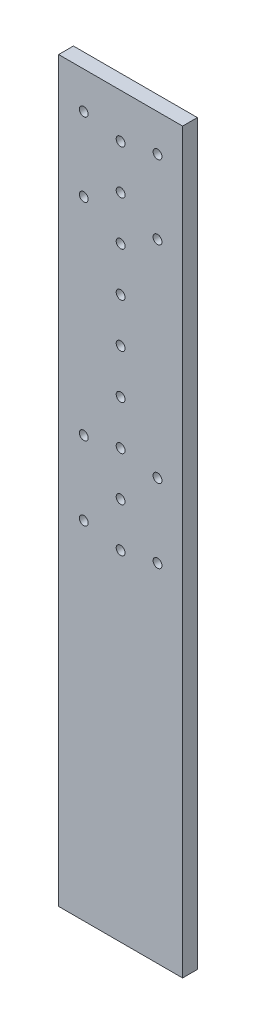
ISO-10303-21;
HEADER;
FILE_DESCRIPTION(('STEP AP214'),'2;1');
FILE_NAME('part.step','',(''),(''),'','','');
FILE_SCHEMA(('AUTOMOTIVE_DESIGN { 1 0 10303 214 1 1 1 1 }'));
ENDSEC;
DATA;
#1=APPLICATION_CONTEXT('core data for automotive mechanical design processes');
#2=APPLICATION_PROTOCOL_DEFINITION('international standard','automotive_design',2000,#1);
#3=PRODUCT_CONTEXT('',#1,'mechanical');
#4=PRODUCT('Part','Part','',(#3));
#5=PRODUCT_RELATED_PRODUCT_CATEGORY('part','',(#4));
#6=PRODUCT_DEFINITION_FORMATION('','',#4);
#7=PRODUCT_DEFINITION_CONTEXT('part definition',#1,'design');
#8=PRODUCT_DEFINITION('design','',#6,#7);
#9=PRODUCT_DEFINITION_SHAPE('','',#8);
#10=(LENGTH_UNIT() NAMED_UNIT(*) SI_UNIT(.MILLI.,.METRE.));
#11=(NAMED_UNIT(*) PLANE_ANGLE_UNIT() SI_UNIT($,.RADIAN.));
#12=(NAMED_UNIT(*) SI_UNIT($,.STERADIAN.) SOLID_ANGLE_UNIT());
#13=UNCERTAINTY_MEASURE_WITH_UNIT(LENGTH_MEASURE(1.E-05),#10,'distance_accuracy_value','');
#14=(GEOMETRIC_REPRESENTATION_CONTEXT(3) GLOBAL_UNCERTAINTY_ASSIGNED_CONTEXT((#13)) GLOBAL_UNIT_ASSIGNED_CONTEXT((#10,
#11,#12)) REPRESENTATION_CONTEXT('',''));
#15=CARTESIAN_POINT('',(0.,0.,0.));
#16=DIRECTION('',(0.,0.,1.));
#17=DIRECTION('',(1.,0.,0.));
#18=AXIS2_PLACEMENT_3D('',#15,#16,#17);
#19=CARTESIAN_POINT('',(0.,0.,5.));
#20=DIRECTION('',(1.,0.,0.));
#21=DIRECTION('',(0.,0.,-1.));
#22=AXIS2_PLACEMENT_3D('',#19,#20,#21);
#23=PLANE('',#22);
#24=DIRECTION('',(0.,-1.,0.));
#25=VECTOR('',#24,1.);
#26=CARTESIAN_POINT('',(0.,0.,0.));
#27=LINE('',#26,#25);
#28=CARTESIAN_POINT('',(0.,250.,0.));
#29=VERTEX_POINT('',#28);
#30=CARTESIAN_POINT('',(0.,0.,0.));
#31=VERTEX_POINT('',#30);
#32=EDGE_CURVE('E96',#29,#31,#27,.T.);
#33=ORIENTED_EDGE('',*,*,#32,.T.);
#34=DIRECTION('',(0.,0.,-1.));
#35=VECTOR('',#34,1.);
#36=CARTESIAN_POINT('',(0.,0.,5.));
#37=LINE('',#36,#35);
#38=CARTESIAN_POINT('',(0.,0.,5.));
#39=VERTEX_POINT('',#38);
#40=EDGE_CURVE('E11',#39,#31,#37,.T.);
#41=ORIENTED_EDGE('',*,*,#40,.F.);
#42=DIRECTION('',(0.,-1.,0.));
#43=VECTOR('',#42,1.);
#44=CARTESIAN_POINT('',(0.,0.,5.));
#45=LINE('',#44,#43);
#46=CARTESIAN_POINT('',(0.,250.,5.));
#47=VERTEX_POINT('',#46);
#48=EDGE_CURVE('E84',#47,#39,#45,.T.);
#49=ORIENTED_EDGE('',*,*,#48,.F.);
#50=DIRECTION('',(0.,0.,-1.));
#51=VECTOR('',#50,1.);
#52=CARTESIAN_POINT('',(0.,250.,5.));
#53=LINE('',#52,#51);
#54=EDGE_CURVE('E92',#47,#29,#53,.T.);
#55=ORIENTED_EDGE('',*,*,#54,.T.);
#56=EDGE_LOOP('',(#33,#41,#49,#55));
#57=FACE_BOUND('',#56,.T.);
#58=ADVANCED_FACE('F33',(#57),#23,.F.);
#59=CARTESIAN_POINT('',(0.,0.,5.));
#60=DIRECTION('',(0.,1.,0.));
#61=DIRECTION('',(0.,0.,1.));
#62=AXIS2_PLACEMENT_3D('',#59,#60,#61);
#63=PLANE('',#62);
#64=DIRECTION('',(1.,0.,0.));
#65=VECTOR('',#64,1.);
#66=CARTESIAN_POINT('',(0.,0.,0.));
#67=LINE('',#66,#65);
#68=CARTESIAN_POINT('',(42.,0.,0.));
#69=VERTEX_POINT('',#68);
#70=EDGE_CURVE('E88',#31,#69,#67,.T.);
#71=ORIENTED_EDGE('',*,*,#70,.T.);
#72=DIRECTION('',(0.,0.,-1.));
#73=VECTOR('',#72,1.);
#74=CARTESIAN_POINT('',(42.,0.,5.));
#75=LINE('',#74,#73);
#76=CARTESIAN_POINT('',(42.,0.,5.));
#77=VERTEX_POINT('',#76);
#78=EDGE_CURVE('E41',#77,#69,#75,.T.);
#79=ORIENTED_EDGE('',*,*,#78,.F.);
#80=DIRECTION('',(1.,0.,0.));
#81=VECTOR('',#80,1.);
#82=CARTESIAN_POINT('',(0.,0.,5.));
#83=LINE('',#82,#81);
#84=EDGE_CURVE('E79',#39,#77,#83,.T.);
#85=ORIENTED_EDGE('',*,*,#84,.F.);
#86=ORIENTED_EDGE('',*,*,#40,.T.);
#87=EDGE_LOOP('',(#71,#79,#85,#86));
#88=FACE_BOUND('',#87,.T.);
#89=ADVANCED_FACE('F87',(#88),#63,.F.);
#90=CARTESIAN_POINT('',(42.,0.,5.));
#91=DIRECTION('',(-1.,0.,0.));
#92=DIRECTION('',(0.,0.,1.));
#93=AXIS2_PLACEMENT_3D('',#90,#91,#92);
#94=PLANE('',#93);
#95=DIRECTION('',(0.,1.,0.));
#96=VECTOR('',#95,1.);
#97=CARTESIAN_POINT('',(42.,0.,0.));
#98=LINE('',#97,#96);
#99=CARTESIAN_POINT('',(42.,250.,0.));
#100=VERTEX_POINT('',#99);
#101=EDGE_CURVE('E66',#69,#100,#98,.T.);
#102=ORIENTED_EDGE('',*,*,#101,.T.);
#103=DIRECTION('',(0.,0.,-1.));
#104=VECTOR('',#103,1.);
#105=CARTESIAN_POINT('',(42.,250.,5.));
#106=LINE('',#105,#104);
#107=CARTESIAN_POINT('',(42.,250.,5.));
#108=VERTEX_POINT('',#107);
#109=EDGE_CURVE('E89',#108,#100,#106,.T.);
#110=ORIENTED_EDGE('',*,*,#109,.F.);
#111=DIRECTION('',(0.,1.,0.));
#112=VECTOR('',#111,1.);
#113=CARTESIAN_POINT('',(42.,0.,5.));
#114=LINE('',#113,#112);
#115=EDGE_CURVE('E82',#77,#108,#114,.T.);
#116=ORIENTED_EDGE('',*,*,#115,.F.);
#117=ORIENTED_EDGE('',*,*,#78,.T.);
#118=EDGE_LOOP('',(#102,#110,#116,#117));
#119=FACE_BOUND('',#118,.T.);
#120=ADVANCED_FACE('F90',(#119),#94,.F.);
#121=CARTESIAN_POINT('',(0.,250.,5.));
#122=DIRECTION('',(0.,-1.,0.));
#123=DIRECTION('',(0.,0.,-1.));
#124=AXIS2_PLACEMENT_3D('',#121,#122,#123);
#125=PLANE('',#124);
#126=DIRECTION('',(-1.,0.,0.));
#127=VECTOR('',#126,1.);
#128=CARTESIAN_POINT('',(0.,250.,0.));
#129=LINE('',#128,#127);
#130=EDGE_CURVE('E72',#100,#29,#129,.T.);
#131=ORIENTED_EDGE('',*,*,#130,.T.);
#132=ORIENTED_EDGE('',*,*,#54,.F.);
#133=DIRECTION('',(-1.,0.,0.));
#134=VECTOR('',#133,1.);
#135=CARTESIAN_POINT('',(0.,250.,5.));
#136=LINE('',#135,#134);
#137=EDGE_CURVE('E49',#108,#47,#136,.T.);
#138=ORIENTED_EDGE('',*,*,#137,.F.);
#139=ORIENTED_EDGE('',*,*,#109,.T.);
#140=EDGE_LOOP('',(#131,#132,#138,#139));
#141=FACE_BOUND('',#140,.T.);
#142=ADVANCED_FACE('F104',(#141),#125,.F.);
#143=CARTESIAN_POINT('',(0.,0.,5.));
#144=DIRECTION('',(0.,0.,-1.));
#145=DIRECTION('',(-1.,0.,0.));
#146=AXIS2_PLACEMENT_3D('',#143,#144,#145);
#147=PLANE('',#146);
#148=CARTESIAN_POINT('',(8.5,117.5,5.));
#149=DIRECTION('',(0.,0.,1.));
#150=DIRECTION('',(1.,0.,0.));
#151=AXIS2_PLACEMENT_3D('',#148,#149,#150);
#152=CIRCLE('',#151,1.5);
#153=CARTESIAN_POINT('',(10.,117.5,5.));
#154=VERTEX_POINT('',#153);
#155=EDGE_CURVE('E206',#154,#154,#152,.T.);
#156=ORIENTED_EDGE('',*,*,#155,.F.);
#157=EDGE_LOOP('',(#156));
#158=FACE_BOUND('',#157,.T.);
#159=CARTESIAN_POINT('',(33.5,117.5,5.));
#160=DIRECTION('',(0.,0.,1.));
#161=DIRECTION('',(1.,0.,0.));
#162=AXIS2_PLACEMENT_3D('',#159,#160,#161);
#163=CIRCLE('',#162,1.5);
#164=CARTESIAN_POINT('',(35.,117.5,5.));
#165=VERTEX_POINT('',#164);
#166=EDGE_CURVE('E200',#165,#165,#163,.T.);
#167=ORIENTED_EDGE('',*,*,#166,.F.);
#168=EDGE_LOOP('',(#167));
#169=FACE_BOUND('',#168,.T.);
#170=CARTESIAN_POINT('',(33.5,142.5,5.));
#171=DIRECTION('',(0.,0.,1.));
#172=DIRECTION('',(1.,0.,0.));
#173=AXIS2_PLACEMENT_3D('',#170,#171,#172);
#174=CIRCLE('',#173,1.5);
#175=CARTESIAN_POINT('',(35.,142.5,5.));
#176=VERTEX_POINT('',#175);
#177=EDGE_CURVE('E194',#176,#176,#174,.T.);
#178=ORIENTED_EDGE('',*,*,#177,.F.);
#179=EDGE_LOOP('',(#178));
#180=FACE_BOUND('',#179,.T.);
#181=CARTESIAN_POINT('',(8.5,142.5,5.));
#182=DIRECTION('',(0.,0.,1.));
#183=DIRECTION('',(1.,0.,0.));
#184=AXIS2_PLACEMENT_3D('',#181,#182,#183);
#185=CIRCLE('',#184,1.5);
#186=CARTESIAN_POINT('',(10.,142.5,5.));
#187=VERTEX_POINT('',#186);
#188=EDGE_CURVE('E188',#187,#187,#185,.T.);
#189=ORIENTED_EDGE('',*,*,#188,.F.);
#190=EDGE_LOOP('',(#189));
#191=FACE_BOUND('',#190,.T.);
#192=CARTESIAN_POINT('',(8.49999999999998,212.5,5.));
#193=DIRECTION('',(0.,0.,1.));
#194=DIRECTION('',(1.,0.,0.));
#195=AXIS2_PLACEMENT_3D('',#192,#193,#194);
#196=CIRCLE('',#195,1.5);
#197=CARTESIAN_POINT('',(9.99999999999999,212.5,5.));
#198=VERTEX_POINT('',#197);
#199=EDGE_CURVE('E182',#198,#198,#196,.T.);
#200=ORIENTED_EDGE('',*,*,#199,.F.);
#201=EDGE_LOOP('',(#200));
#202=FACE_BOUND('',#201,.T.);
#203=CARTESIAN_POINT('',(33.5,212.5,5.));
#204=DIRECTION('',(0.,0.,1.));
#205=DIRECTION('',(1.,0.,0.));
#206=AXIS2_PLACEMENT_3D('',#203,#204,#205);
#207=CIRCLE('',#206,1.5);
#208=CARTESIAN_POINT('',(35.,212.5,5.));
#209=VERTEX_POINT('',#208);
#210=EDGE_CURVE('E176',#209,#209,#207,.T.);
#211=ORIENTED_EDGE('',*,*,#210,.F.);
#212=EDGE_LOOP('',(#211));
#213=FACE_BOUND('',#212,.T.);
#214=CARTESIAN_POINT('',(33.5,237.5,5.));
#215=DIRECTION('',(0.,0.,1.));
#216=DIRECTION('',(1.,0.,0.));
#217=AXIS2_PLACEMENT_3D('',#214,#215,#216);
#218=CIRCLE('',#217,1.5);
#219=CARTESIAN_POINT('',(35.,237.5,5.));
#220=VERTEX_POINT('',#219);
#221=EDGE_CURVE('E170',#220,#220,#218,.T.);
#222=ORIENTED_EDGE('',*,*,#221,.F.);
#223=EDGE_LOOP('',(#222));
#224=FACE_BOUND('',#223,.T.);
#225=CARTESIAN_POINT('',(8.49999999999998,237.5,5.));
#226=DIRECTION('',(0.,0.,1.));
#227=DIRECTION('',(1.,0.,0.));
#228=AXIS2_PLACEMENT_3D('',#225,#226,#227);
#229=CIRCLE('',#228,1.5);
#230=CARTESIAN_POINT('',(9.99999999999998,237.5,5.));
#231=VERTEX_POINT('',#230);
#232=EDGE_CURVE('E164',#231,#231,#229,.T.);
#233=ORIENTED_EDGE('',*,*,#232,.F.);
#234=EDGE_LOOP('',(#233));
#235=FACE_BOUND('',#234,.T.);
#236=CARTESIAN_POINT('',(21.0000000000012,115.,5.));
#237=DIRECTION('',(0.,0.,1.));
#238=DIRECTION('',(1.,0.,0.));
#239=AXIS2_PLACEMENT_3D('',#236,#237,#238);
#240=CIRCLE('',#239,1.5);
#241=CARTESIAN_POINT('',(22.5000000000012,115.,5.));
#242=VERTEX_POINT('',#241);
#243=EDGE_CURVE('E158',#242,#242,#240,.T.);
#244=ORIENTED_EDGE('',*,*,#243,.F.);
#245=EDGE_LOOP('',(#244));
#246=FACE_BOUND('',#245,.T.);
#247=CARTESIAN_POINT('',(21.0000000000011,130.,5.));
#248=DIRECTION('',(0.,0.,1.));
#249=DIRECTION('',(1.,0.,0.));
#250=AXIS2_PLACEMENT_3D('',#247,#248,#249);
#251=CIRCLE('',#250,1.5);
#252=CARTESIAN_POINT('',(22.5000000000011,130.,5.));
#253=VERTEX_POINT('',#252);
#254=EDGE_CURVE('E152',#253,#253,#251,.T.);
#255=ORIENTED_EDGE('',*,*,#254,.F.);
#256=EDGE_LOOP('',(#255));
#257=FACE_BOUND('',#256,.T.);
#258=CARTESIAN_POINT('',(21.0000000000009,145.,5.));
#259=DIRECTION('',(0.,0.,1.));
#260=DIRECTION('',(1.,0.,0.));
#261=AXIS2_PLACEMENT_3D('',#258,#259,#260);
#262=CIRCLE('',#261,1.5);
#263=CARTESIAN_POINT('',(22.5000000000009,145.,5.));
#264=VERTEX_POINT('',#263);
#265=EDGE_CURVE('E146',#264,#264,#262,.T.);
#266=ORIENTED_EDGE('',*,*,#265,.F.);
#267=EDGE_LOOP('',(#266));
#268=FACE_BOUND('',#267,.T.);
#269=CARTESIAN_POINT('',(21.0000000000008,160.,5.));
#270=DIRECTION('',(0.,0.,1.));
#271=DIRECTION('',(1.,0.,0.));
#272=AXIS2_PLACEMENT_3D('',#269,#270,#271);
#273=CIRCLE('',#272,1.5);
#274=CARTESIAN_POINT('',(22.5000000000008,160.,5.));
#275=VERTEX_POINT('',#274);
#276=EDGE_CURVE('E140',#275,#275,#273,.T.);
#277=ORIENTED_EDGE('',*,*,#276,.F.);
#278=EDGE_LOOP('',(#277));
#279=FACE_BOUND('',#278,.T.);
#280=CARTESIAN_POINT('',(21.0000000000006,175.,5.));
#281=DIRECTION('',(0.,0.,1.));
#282=DIRECTION('',(1.,0.,0.));
#283=AXIS2_PLACEMENT_3D('',#280,#281,#282);
#284=CIRCLE('',#283,1.5);
#285=CARTESIAN_POINT('',(22.5000000000006,175.,5.));
#286=VERTEX_POINT('',#285);
#287=EDGE_CURVE('E134',#286,#286,#284,.T.);
#288=ORIENTED_EDGE('',*,*,#287,.F.);
#289=EDGE_LOOP('',(#288));
#290=FACE_BOUND('',#289,.T.);
#291=CARTESIAN_POINT('',(21.0000000000004,190.,5.));
#292=DIRECTION('',(0.,0.,1.));
#293=DIRECTION('',(1.,0.,0.));
#294=AXIS2_PLACEMENT_3D('',#291,#292,#293);
#295=CIRCLE('',#294,1.5);
#296=CARTESIAN_POINT('',(22.5000000000004,190.,5.));
#297=VERTEX_POINT('',#296);
#298=EDGE_CURVE('E128',#297,#297,#295,.T.);
#299=ORIENTED_EDGE('',*,*,#298,.F.);
#300=EDGE_LOOP('',(#299));
#301=FACE_BOUND('',#300,.T.);
#302=CARTESIAN_POINT('',(21.0000000000003,205.,5.));
#303=DIRECTION('',(0.,0.,1.));
#304=DIRECTION('',(1.,0.,0.));
#305=AXIS2_PLACEMENT_3D('',#302,#303,#304);
#306=CIRCLE('',#305,1.5);
#307=CARTESIAN_POINT('',(22.5000000000003,205.,5.));
#308=VERTEX_POINT('',#307);
#309=EDGE_CURVE('E122',#308,#308,#306,.T.);
#310=ORIENTED_EDGE('',*,*,#309,.F.);
#311=EDGE_LOOP('',(#310));
#312=FACE_BOUND('',#311,.T.);
#313=CARTESIAN_POINT('',(21.0000000000001,220.,5.));
#314=DIRECTION('',(0.,0.,1.));
#315=DIRECTION('',(1.,0.,0.));
#316=AXIS2_PLACEMENT_3D('',#313,#314,#315);
#317=CIRCLE('',#316,1.5);
#318=CARTESIAN_POINT('',(22.5000000000001,220.,5.));
#319=VERTEX_POINT('',#318);
#320=EDGE_CURVE('E116',#319,#319,#317,.T.);
#321=ORIENTED_EDGE('',*,*,#320,.F.);
#322=EDGE_LOOP('',(#321));
#323=FACE_BOUND('',#322,.T.);
#324=CARTESIAN_POINT('',(21.,235.,5.));
#325=DIRECTION('',(0.,0.,1.));
#326=DIRECTION('',(1.,0.,0.));
#327=AXIS2_PLACEMENT_3D('',#324,#325,#326);
#328=CIRCLE('',#327,1.5);
#329=CARTESIAN_POINT('',(22.5,235.,5.));
#330=VERTEX_POINT('',#329);
#331=EDGE_CURVE('E110',#330,#330,#328,.T.);
#332=ORIENTED_EDGE('',*,*,#331,.F.);
#333=EDGE_LOOP('',(#332));
#334=FACE_BOUND('',#333,.T.);
#335=ORIENTED_EDGE('',*,*,#48,.T.);
#336=ORIENTED_EDGE('',*,*,#84,.T.);
#337=ORIENTED_EDGE('',*,*,#115,.T.);
#338=ORIENTED_EDGE('',*,*,#137,.T.);
#339=EDGE_LOOP('',(#335,#336,#337,#338));
#340=FACE_BOUND('',#339,.T.);
#341=ADVANCED_FACE('F80',(#158,#169,#180,#191,#202,#213,#224,#235,#246,#257,#268,#279,#290,#301,
#312,#323,#334,#340),#147,.F.);
#342=CARTESIAN_POINT('',(0.,0.,0.));
#343=DIRECTION('',(0.,0.,-1.));
#344=DIRECTION('',(-1.,0.,0.));
#345=AXIS2_PLACEMENT_3D('',#342,#343,#344);
#346=PLANE('',#345);
#347=CARTESIAN_POINT('',(8.5,117.5,0.));
#348=DIRECTION('',(0.,0.,1.));
#349=DIRECTION('',(1.,0.,0.));
#350=AXIS2_PLACEMENT_3D('',#347,#348,#349);
#351=CIRCLE('',#350,1.5);
#352=CARTESIAN_POINT('',(10.,117.5,0.));
#353=VERTEX_POINT('',#352);
#354=EDGE_CURVE('E203',#353,#353,#351,.T.);
#355=ORIENTED_EDGE('',*,*,#354,.T.);
#356=EDGE_LOOP('',(#355));
#357=FACE_BOUND('',#356,.T.);
#358=CARTESIAN_POINT('',(33.5,117.5,0.));
#359=DIRECTION('',(0.,0.,1.));
#360=DIRECTION('',(1.,0.,0.));
#361=AXIS2_PLACEMENT_3D('',#358,#359,#360);
#362=CIRCLE('',#361,1.5);
#363=CARTESIAN_POINT('',(35.,117.5,0.));
#364=VERTEX_POINT('',#363);
#365=EDGE_CURVE('E197',#364,#364,#362,.T.);
#366=ORIENTED_EDGE('',*,*,#365,.T.);
#367=EDGE_LOOP('',(#366));
#368=FACE_BOUND('',#367,.T.);
#369=CARTESIAN_POINT('',(33.5,142.5,0.));
#370=DIRECTION('',(0.,0.,1.));
#371=DIRECTION('',(1.,0.,0.));
#372=AXIS2_PLACEMENT_3D('',#369,#370,#371);
#373=CIRCLE('',#372,1.5);
#374=CARTESIAN_POINT('',(35.,142.5,0.));
#375=VERTEX_POINT('',#374);
#376=EDGE_CURVE('E191',#375,#375,#373,.T.);
#377=ORIENTED_EDGE('',*,*,#376,.T.);
#378=EDGE_LOOP('',(#377));
#379=FACE_BOUND('',#378,.T.);
#380=CARTESIAN_POINT('',(8.5,142.5,0.));
#381=DIRECTION('',(0.,0.,1.));
#382=DIRECTION('',(1.,0.,0.));
#383=AXIS2_PLACEMENT_3D('',#380,#381,#382);
#384=CIRCLE('',#383,1.5);
#385=CARTESIAN_POINT('',(10.,142.5,0.));
#386=VERTEX_POINT('',#385);
#387=EDGE_CURVE('E185',#386,#386,#384,.T.);
#388=ORIENTED_EDGE('',*,*,#387,.T.);
#389=EDGE_LOOP('',(#388));
#390=FACE_BOUND('',#389,.T.);
#391=CARTESIAN_POINT('',(8.49999999999998,212.5,0.));
#392=DIRECTION('',(0.,0.,1.));
#393=DIRECTION('',(1.,0.,0.));
#394=AXIS2_PLACEMENT_3D('',#391,#392,#393);
#395=CIRCLE('',#394,1.5);
#396=CARTESIAN_POINT('',(9.99999999999999,212.5,0.));
#397=VERTEX_POINT('',#396);
#398=EDGE_CURVE('E179',#397,#397,#395,.T.);
#399=ORIENTED_EDGE('',*,*,#398,.T.);
#400=EDGE_LOOP('',(#399));
#401=FACE_BOUND('',#400,.T.);
#402=CARTESIAN_POINT('',(33.5,212.5,0.));
#403=DIRECTION('',(0.,0.,1.));
#404=DIRECTION('',(1.,0.,0.));
#405=AXIS2_PLACEMENT_3D('',#402,#403,#404);
#406=CIRCLE('',#405,1.5);
#407=CARTESIAN_POINT('',(35.,212.5,0.));
#408=VERTEX_POINT('',#407);
#409=EDGE_CURVE('E173',#408,#408,#406,.T.);
#410=ORIENTED_EDGE('',*,*,#409,.T.);
#411=EDGE_LOOP('',(#410));
#412=FACE_BOUND('',#411,.T.);
#413=CARTESIAN_POINT('',(33.5,237.5,0.));
#414=DIRECTION('',(0.,0.,1.));
#415=DIRECTION('',(1.,0.,0.));
#416=AXIS2_PLACEMENT_3D('',#413,#414,#415);
#417=CIRCLE('',#416,1.5);
#418=CARTESIAN_POINT('',(35.,237.5,0.));
#419=VERTEX_POINT('',#418);
#420=EDGE_CURVE('E167',#419,#419,#417,.T.);
#421=ORIENTED_EDGE('',*,*,#420,.T.);
#422=EDGE_LOOP('',(#421));
#423=FACE_BOUND('',#422,.T.);
#424=CARTESIAN_POINT('',(8.49999999999998,237.5,0.));
#425=DIRECTION('',(0.,0.,1.));
#426=DIRECTION('',(1.,0.,0.));
#427=AXIS2_PLACEMENT_3D('',#424,#425,#426);
#428=CIRCLE('',#427,1.5);
#429=CARTESIAN_POINT('',(9.99999999999998,237.5,0.));
#430=VERTEX_POINT('',#429);
#431=EDGE_CURVE('E161',#430,#430,#428,.T.);
#432=ORIENTED_EDGE('',*,*,#431,.T.);
#433=EDGE_LOOP('',(#432));
#434=FACE_BOUND('',#433,.T.);
#435=CARTESIAN_POINT('',(21.0000000000012,115.,0.));
#436=DIRECTION('',(0.,0.,1.));
#437=DIRECTION('',(1.,0.,0.));
#438=AXIS2_PLACEMENT_3D('',#435,#436,#437);
#439=CIRCLE('',#438,1.5);
#440=CARTESIAN_POINT('',(22.5000000000012,115.,0.));
#441=VERTEX_POINT('',#440);
#442=EDGE_CURVE('E155',#441,#441,#439,.T.);
#443=ORIENTED_EDGE('',*,*,#442,.T.);
#444=EDGE_LOOP('',(#443));
#445=FACE_BOUND('',#444,.T.);
#446=CARTESIAN_POINT('',(21.0000000000011,130.,0.));
#447=DIRECTION('',(0.,0.,1.));
#448=DIRECTION('',(1.,0.,0.));
#449=AXIS2_PLACEMENT_3D('',#446,#447,#448);
#450=CIRCLE('',#449,1.5);
#451=CARTESIAN_POINT('',(22.5000000000011,130.,0.));
#452=VERTEX_POINT('',#451);
#453=EDGE_CURVE('E149',#452,#452,#450,.T.);
#454=ORIENTED_EDGE('',*,*,#453,.T.);
#455=EDGE_LOOP('',(#454));
#456=FACE_BOUND('',#455,.T.);
#457=CARTESIAN_POINT('',(21.0000000000009,145.,0.));
#458=DIRECTION('',(0.,0.,1.));
#459=DIRECTION('',(1.,0.,0.));
#460=AXIS2_PLACEMENT_3D('',#457,#458,#459);
#461=CIRCLE('',#460,1.5);
#462=CARTESIAN_POINT('',(22.5000000000009,145.,0.));
#463=VERTEX_POINT('',#462);
#464=EDGE_CURVE('E143',#463,#463,#461,.T.);
#465=ORIENTED_EDGE('',*,*,#464,.T.);
#466=EDGE_LOOP('',(#465));
#467=FACE_BOUND('',#466,.T.);
#468=CARTESIAN_POINT('',(21.0000000000008,160.,0.));
#469=DIRECTION('',(0.,0.,1.));
#470=DIRECTION('',(1.,0.,0.));
#471=AXIS2_PLACEMENT_3D('',#468,#469,#470);
#472=CIRCLE('',#471,1.5);
#473=CARTESIAN_POINT('',(22.5000000000008,160.,0.));
#474=VERTEX_POINT('',#473);
#475=EDGE_CURVE('E137',#474,#474,#472,.T.);
#476=ORIENTED_EDGE('',*,*,#475,.T.);
#477=EDGE_LOOP('',(#476));
#478=FACE_BOUND('',#477,.T.);
#479=CARTESIAN_POINT('',(21.0000000000006,175.,0.));
#480=DIRECTION('',(0.,0.,1.));
#481=DIRECTION('',(1.,0.,0.));
#482=AXIS2_PLACEMENT_3D('',#479,#480,#481);
#483=CIRCLE('',#482,1.5);
#484=CARTESIAN_POINT('',(22.5000000000006,175.,0.));
#485=VERTEX_POINT('',#484);
#486=EDGE_CURVE('E131',#485,#485,#483,.T.);
#487=ORIENTED_EDGE('',*,*,#486,.T.);
#488=EDGE_LOOP('',(#487));
#489=FACE_BOUND('',#488,.T.);
#490=CARTESIAN_POINT('',(21.0000000000004,190.,0.));
#491=DIRECTION('',(0.,0.,1.));
#492=DIRECTION('',(1.,0.,0.));
#493=AXIS2_PLACEMENT_3D('',#490,#491,#492);
#494=CIRCLE('',#493,1.5);
#495=CARTESIAN_POINT('',(22.5000000000004,190.,0.));
#496=VERTEX_POINT('',#495);
#497=EDGE_CURVE('E125',#496,#496,#494,.T.);
#498=ORIENTED_EDGE('',*,*,#497,.T.);
#499=EDGE_LOOP('',(#498));
#500=FACE_BOUND('',#499,.T.);
#501=CARTESIAN_POINT('',(21.0000000000003,205.,0.));
#502=DIRECTION('',(0.,0.,1.));
#503=DIRECTION('',(1.,0.,0.));
#504=AXIS2_PLACEMENT_3D('',#501,#502,#503);
#505=CIRCLE('',#504,1.5);
#506=CARTESIAN_POINT('',(22.5000000000003,205.,0.));
#507=VERTEX_POINT('',#506);
#508=EDGE_CURVE('E119',#507,#507,#505,.T.);
#509=ORIENTED_EDGE('',*,*,#508,.T.);
#510=EDGE_LOOP('',(#509));
#511=FACE_BOUND('',#510,.T.);
#512=CARTESIAN_POINT('',(21.0000000000001,220.,0.));
#513=DIRECTION('',(0.,0.,1.));
#514=DIRECTION('',(1.,0.,0.));
#515=AXIS2_PLACEMENT_3D('',#512,#513,#514);
#516=CIRCLE('',#515,1.5);
#517=CARTESIAN_POINT('',(22.5000000000001,220.,0.));
#518=VERTEX_POINT('',#517);
#519=EDGE_CURVE('E113',#518,#518,#516,.T.);
#520=ORIENTED_EDGE('',*,*,#519,.T.);
#521=EDGE_LOOP('',(#520));
#522=FACE_BOUND('',#521,.T.);
#523=CARTESIAN_POINT('',(21.,235.,0.));
#524=DIRECTION('',(0.,0.,1.));
#525=DIRECTION('',(1.,0.,0.));
#526=AXIS2_PLACEMENT_3D('',#523,#524,#525);
#527=CIRCLE('',#526,1.5);
#528=CARTESIAN_POINT('',(22.5,235.,0.));
#529=VERTEX_POINT('',#528);
#530=EDGE_CURVE('E99',#529,#529,#527,.T.);
#531=ORIENTED_EDGE('',*,*,#530,.T.);
#532=EDGE_LOOP('',(#531));
#533=FACE_BOUND('',#532,.T.);
#534=ORIENTED_EDGE('',*,*,#32,.F.);
#535=ORIENTED_EDGE('',*,*,#130,.F.);
#536=ORIENTED_EDGE('',*,*,#101,.F.);
#537=ORIENTED_EDGE('',*,*,#70,.F.);
#538=EDGE_LOOP('',(#534,#535,#536,#537));
#539=FACE_BOUND('',#538,.T.);
#540=ADVANCED_FACE('F107',(#357,#368,#379,#390,#401,#412,#423,#434,#445,#456,#467,#478,#489,
#500,#511,#522,#533,#539),#346,.T.);
#541=CARTESIAN_POINT('',(21.,235.,0.));
#542=DIRECTION('',(0.,0.,1.));
#543=DIRECTION('',(1.,0.,0.));
#544=AXIS2_PLACEMENT_3D('',#541,#542,#543);
#545=CYLINDRICAL_SURFACE('',#544,1.5);
#546=ORIENTED_EDGE('',*,*,#530,.F.);
#547=EDGE_LOOP('',(#546));
#548=FACE_BOUND('',#547,.T.);
#549=ORIENTED_EDGE('',*,*,#331,.T.);
#550=EDGE_LOOP('',(#549));
#551=FACE_BOUND('',#550,.T.);
#552=ADVANCED_FACE('F256',(#548,#551),#545,.F.);
#553=CARTESIAN_POINT('',(21.0000000000001,220.,0.));
#554=DIRECTION('',(0.,0.,1.));
#555=DIRECTION('',(1.,0.,0.));
#556=AXIS2_PLACEMENT_3D('',#553,#554,#555);
#557=CYLINDRICAL_SURFACE('',#556,1.5);
#558=ORIENTED_EDGE('',*,*,#519,.F.);
#559=EDGE_LOOP('',(#558));
#560=FACE_BOUND('',#559,.T.);
#561=ORIENTED_EDGE('',*,*,#320,.T.);
#562=EDGE_LOOP('',(#561));
#563=FACE_BOUND('',#562,.T.);
#564=ADVANCED_FACE('F258',(#560,#563),#557,.F.);
#565=CARTESIAN_POINT('',(21.0000000000003,205.,0.));
#566=DIRECTION('',(0.,0.,1.));
#567=DIRECTION('',(1.,0.,0.));
#568=AXIS2_PLACEMENT_3D('',#565,#566,#567);
#569=CYLINDRICAL_SURFACE('',#568,1.5);
#570=ORIENTED_EDGE('',*,*,#508,.F.);
#571=EDGE_LOOP('',(#570));
#572=FACE_BOUND('',#571,.T.);
#573=ORIENTED_EDGE('',*,*,#309,.T.);
#574=EDGE_LOOP('',(#573));
#575=FACE_BOUND('',#574,.T.);
#576=ADVANCED_FACE('F265',(#572,#575),#569,.F.);
#577=CARTESIAN_POINT('',(21.0000000000004,190.,0.));
#578=DIRECTION('',(0.,0.,1.));
#579=DIRECTION('',(1.,0.,0.));
#580=AXIS2_PLACEMENT_3D('',#577,#578,#579);
#581=CYLINDRICAL_SURFACE('',#580,1.5);
#582=ORIENTED_EDGE('',*,*,#497,.F.);
#583=EDGE_LOOP('',(#582));
#584=FACE_BOUND('',#583,.T.);
#585=ORIENTED_EDGE('',*,*,#298,.T.);
#586=EDGE_LOOP('',(#585));
#587=FACE_BOUND('',#586,.T.);
#588=ADVANCED_FACE('F311',(#584,#587),#581,.F.);
#589=CARTESIAN_POINT('',(21.0000000000006,175.,0.));
#590=DIRECTION('',(0.,0.,1.));
#591=DIRECTION('',(1.,0.,0.));
#592=AXIS2_PLACEMENT_3D('',#589,#590,#591);
#593=CYLINDRICAL_SURFACE('',#592,1.5);
#594=ORIENTED_EDGE('',*,*,#486,.F.);
#595=EDGE_LOOP('',(#594));
#596=FACE_BOUND('',#595,.T.);
#597=ORIENTED_EDGE('',*,*,#287,.T.);
#598=EDGE_LOOP('',(#597));
#599=FACE_BOUND('',#598,.T.);
#600=ADVANCED_FACE('F321',(#596,#599),#593,.F.);
#601=CARTESIAN_POINT('',(21.0000000000008,160.,0.));
#602=DIRECTION('',(0.,0.,1.));
#603=DIRECTION('',(1.,0.,0.));
#604=AXIS2_PLACEMENT_3D('',#601,#602,#603);
#605=CYLINDRICAL_SURFACE('',#604,1.5);
#606=ORIENTED_EDGE('',*,*,#475,.F.);
#607=EDGE_LOOP('',(#606));
#608=FACE_BOUND('',#607,.T.);
#609=ORIENTED_EDGE('',*,*,#276,.T.);
#610=EDGE_LOOP('',(#609));
#611=FACE_BOUND('',#610,.T.);
#612=ADVANCED_FACE('F331',(#608,#611),#605,.F.);
#613=CARTESIAN_POINT('',(21.0000000000009,145.,0.));
#614=DIRECTION('',(0.,0.,1.));
#615=DIRECTION('',(1.,0.,0.));
#616=AXIS2_PLACEMENT_3D('',#613,#614,#615);
#617=CYLINDRICAL_SURFACE('',#616,1.5);
#618=ORIENTED_EDGE('',*,*,#464,.F.);
#619=EDGE_LOOP('',(#618));
#620=FACE_BOUND('',#619,.T.);
#621=ORIENTED_EDGE('',*,*,#265,.T.);
#622=EDGE_LOOP('',(#621));
#623=FACE_BOUND('',#622,.T.);
#624=ADVANCED_FACE('F341',(#620,#623),#617,.F.);
#625=CARTESIAN_POINT('',(21.0000000000011,130.,0.));
#626=DIRECTION('',(0.,0.,1.));
#627=DIRECTION('',(1.,0.,0.));
#628=AXIS2_PLACEMENT_3D('',#625,#626,#627);
#629=CYLINDRICAL_SURFACE('',#628,1.5);
#630=ORIENTED_EDGE('',*,*,#453,.F.);
#631=EDGE_LOOP('',(#630));
#632=FACE_BOUND('',#631,.T.);
#633=ORIENTED_EDGE('',*,*,#254,.T.);
#634=EDGE_LOOP('',(#633));
#635=FACE_BOUND('',#634,.T.);
#636=ADVANCED_FACE('F351',(#632,#635),#629,.F.);
#637=CARTESIAN_POINT('',(21.0000000000012,115.,0.));
#638=DIRECTION('',(0.,0.,1.));
#639=DIRECTION('',(1.,0.,0.));
#640=AXIS2_PLACEMENT_3D('',#637,#638,#639);
#641=CYLINDRICAL_SURFACE('',#640,1.5);
#642=ORIENTED_EDGE('',*,*,#442,.F.);
#643=EDGE_LOOP('',(#642));
#644=FACE_BOUND('',#643,.T.);
#645=ORIENTED_EDGE('',*,*,#243,.T.);
#646=EDGE_LOOP('',(#645));
#647=FACE_BOUND('',#646,.T.);
#648=ADVANCED_FACE('F361',(#644,#647),#641,.F.);
#649=CARTESIAN_POINT('',(8.49999999999998,237.5,0.));
#650=DIRECTION('',(0.,0.,1.));
#651=DIRECTION('',(1.,0.,0.));
#652=AXIS2_PLACEMENT_3D('',#649,#650,#651);
#653=CYLINDRICAL_SURFACE('',#652,1.5);
#654=ORIENTED_EDGE('',*,*,#431,.F.);
#655=EDGE_LOOP('',(#654));
#656=FACE_BOUND('',#655,.T.);
#657=ORIENTED_EDGE('',*,*,#232,.T.);
#658=EDGE_LOOP('',(#657));
#659=FACE_BOUND('',#658,.T.);
#660=ADVANCED_FACE('F371',(#656,#659),#653,.F.);
#661=CARTESIAN_POINT('',(33.5,237.5,0.));
#662=DIRECTION('',(0.,0.,1.));
#663=DIRECTION('',(1.,0.,0.));
#664=AXIS2_PLACEMENT_3D('',#661,#662,#663);
#665=CYLINDRICAL_SURFACE('',#664,1.5);
#666=ORIENTED_EDGE('',*,*,#420,.F.);
#667=EDGE_LOOP('',(#666));
#668=FACE_BOUND('',#667,.T.);
#669=ORIENTED_EDGE('',*,*,#221,.T.);
#670=EDGE_LOOP('',(#669));
#671=FACE_BOUND('',#670,.T.);
#672=ADVANCED_FACE('F381',(#668,#671),#665,.F.);
#673=CARTESIAN_POINT('',(33.5,212.5,0.));
#674=DIRECTION('',(0.,0.,1.));
#675=DIRECTION('',(1.,0.,0.));
#676=AXIS2_PLACEMENT_3D('',#673,#674,#675);
#677=CYLINDRICAL_SURFACE('',#676,1.5);
#678=ORIENTED_EDGE('',*,*,#409,.F.);
#679=EDGE_LOOP('',(#678));
#680=FACE_BOUND('',#679,.T.);
#681=ORIENTED_EDGE('',*,*,#210,.T.);
#682=EDGE_LOOP('',(#681));
#683=FACE_BOUND('',#682,.T.);
#684=ADVANCED_FACE('F391',(#680,#683),#677,.F.);
#685=CARTESIAN_POINT('',(8.49999999999998,212.5,0.));
#686=DIRECTION('',(0.,0.,1.));
#687=DIRECTION('',(1.,0.,0.));
#688=AXIS2_PLACEMENT_3D('',#685,#686,#687);
#689=CYLINDRICAL_SURFACE('',#688,1.5);
#690=ORIENTED_EDGE('',*,*,#398,.F.);
#691=EDGE_LOOP('',(#690));
#692=FACE_BOUND('',#691,.T.);
#693=ORIENTED_EDGE('',*,*,#199,.T.);
#694=EDGE_LOOP('',(#693));
#695=FACE_BOUND('',#694,.T.);
#696=ADVANCED_FACE('F401',(#692,#695),#689,.F.);
#697=CARTESIAN_POINT('',(8.5,142.5,0.));
#698=DIRECTION('',(0.,0.,1.));
#699=DIRECTION('',(1.,0.,0.));
#700=AXIS2_PLACEMENT_3D('',#697,#698,#699);
#701=CYLINDRICAL_SURFACE('',#700,1.5);
#702=ORIENTED_EDGE('',*,*,#387,.F.);
#703=EDGE_LOOP('',(#702));
#704=FACE_BOUND('',#703,.T.);
#705=ORIENTED_EDGE('',*,*,#188,.T.);
#706=EDGE_LOOP('',(#705));
#707=FACE_BOUND('',#706,.T.);
#708=ADVANCED_FACE('F411',(#704,#707),#701,.F.);
#709=CARTESIAN_POINT('',(33.5,142.5,0.));
#710=DIRECTION('',(0.,0.,1.));
#711=DIRECTION('',(1.,0.,0.));
#712=AXIS2_PLACEMENT_3D('',#709,#710,#711);
#713=CYLINDRICAL_SURFACE('',#712,1.5);
#714=ORIENTED_EDGE('',*,*,#376,.F.);
#715=EDGE_LOOP('',(#714));
#716=FACE_BOUND('',#715,.T.);
#717=ORIENTED_EDGE('',*,*,#177,.T.);
#718=EDGE_LOOP('',(#717));
#719=FACE_BOUND('',#718,.T.);
#720=ADVANCED_FACE('F421',(#716,#719),#713,.F.);
#721=CARTESIAN_POINT('',(33.5,117.5,0.));
#722=DIRECTION('',(0.,0.,1.));
#723=DIRECTION('',(1.,0.,0.));
#724=AXIS2_PLACEMENT_3D('',#721,#722,#723);
#725=CYLINDRICAL_SURFACE('',#724,1.5);
#726=ORIENTED_EDGE('',*,*,#365,.F.);
#727=EDGE_LOOP('',(#726));
#728=FACE_BOUND('',#727,.T.);
#729=ORIENTED_EDGE('',*,*,#166,.T.);
#730=EDGE_LOOP('',(#729));
#731=FACE_BOUND('',#730,.T.);
#732=ADVANCED_FACE('F217',(#728,#731),#725,.F.);
#733=CARTESIAN_POINT('',(8.5,117.5,0.));
#734=DIRECTION('',(0.,0.,1.));
#735=DIRECTION('',(1.,0.,0.));
#736=AXIS2_PLACEMENT_3D('',#733,#734,#735);
#737=CYLINDRICAL_SURFACE('',#736,1.5);
#738=ORIENTED_EDGE('',*,*,#354,.F.);
#739=EDGE_LOOP('',(#738));
#740=FACE_BOUND('',#739,.T.);
#741=ORIENTED_EDGE('',*,*,#155,.T.);
#742=EDGE_LOOP('',(#741));
#743=FACE_BOUND('',#742,.T.);
#744=ADVANCED_FACE('F214',(#740,#743),#737,.F.);
#745=CLOSED_SHELL('',(#58,#89,#120,#142,#341,#540,#552,#564,#576,#588,#600,#612,#624,#636,#648,
#660,#672,#684,#696,#708,#720,#732,#744));
#746=MANIFOLD_SOLID_BREP('B2',#745);
#747=ADVANCED_BREP_SHAPE_REPRESENTATION('',(#18,#746),#14);
#748=SHAPE_DEFINITION_REPRESENTATION(#9,#747);
ENDSEC;
END-ISO-10303-21;
